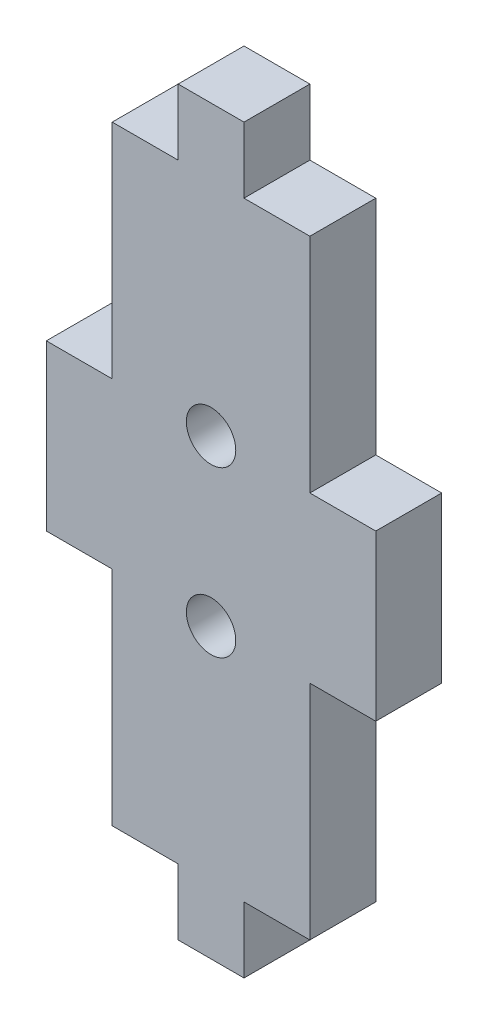
ISO-10303-21;
HEADER;
FILE_DESCRIPTION(('STEP AP214'),'2;1');
FILE_NAME('part.step','',(''),(''),'','','');
FILE_SCHEMA(('AUTOMOTIVE_DESIGN { 1 0 10303 214 1 1 1 1 }'));
ENDSEC;
DATA;
#1=APPLICATION_CONTEXT('core data for automotive mechanical design processes');
#2=APPLICATION_PROTOCOL_DEFINITION('international standard','automotive_design',2000,#1);
#3=PRODUCT_CONTEXT('',#1,'mechanical');
#4=PRODUCT('Part','Part','',(#3));
#5=PRODUCT_RELATED_PRODUCT_CATEGORY('part','',(#4));
#6=PRODUCT_DEFINITION_FORMATION('','',#4);
#7=PRODUCT_DEFINITION_CONTEXT('part definition',#1,'design');
#8=PRODUCT_DEFINITION('design','',#6,#7);
#9=PRODUCT_DEFINITION_SHAPE('','',#8);
#10=(LENGTH_UNIT() NAMED_UNIT(*) SI_UNIT(.MILLI.,.METRE.));
#11=(NAMED_UNIT(*) PLANE_ANGLE_UNIT() SI_UNIT($,.RADIAN.));
#12=(NAMED_UNIT(*) SI_UNIT($,.STERADIAN.) SOLID_ANGLE_UNIT());
#13=UNCERTAINTY_MEASURE_WITH_UNIT(LENGTH_MEASURE(1.E-05),#10,'distance_accuracy_value','');
#14=(GEOMETRIC_REPRESENTATION_CONTEXT(3) GLOBAL_UNCERTAINTY_ASSIGNED_CONTEXT((#13)) GLOBAL_UNIT_ASSIGNED_CONTEXT((#10,
#11,#12)) REPRESENTATION_CONTEXT('',''));
#15=CARTESIAN_POINT('',(0.,0.,0.));
#16=DIRECTION('',(0.,0.,1.));
#17=DIRECTION('',(1.,0.,0.));
#18=AXIS2_PLACEMENT_3D('',#15,#16,#17);
#19=CARTESIAN_POINT('',(0.,0.,4.));
#20=DIRECTION('',(0.,0.,1.));
#21=DIRECTION('',(1.,0.,0.));
#22=AXIS2_PLACEMENT_3D('',#19,#20,#21);
#23=PLANE('',#22);
#24=CARTESIAN_POINT('',(6.,23.5,4.));
#25=DIRECTION('',(0.,0.,1.));
#26=DIRECTION('',(1.,0.,0.));
#27=AXIS2_PLACEMENT_3D('',#24,#25,#26);
#28=CIRCLE('',#27,1.5);
#29=CARTESIAN_POINT('',(7.5,23.5,4.));
#30=VERTEX_POINT('',#29);
#31=EDGE_CURVE('E218',#30,#30,#28,.T.);
#32=ORIENTED_EDGE('',*,*,#31,.F.);
#33=EDGE_LOOP('',(#32));
#34=FACE_BOUND('',#33,.T.);
#35=DIRECTION('',(0.,-1.,0.));
#36=VECTOR('',#35,1.);
#37=CARTESIAN_POINT('',(0.,0.,4.));
#38=LINE('',#37,#36);
#39=CARTESIAN_POINT('',(0.,13.5,4.));
#40=VERTEX_POINT('',#39);
#41=CARTESIAN_POINT('',(0.,0.,4.));
#42=VERTEX_POINT('',#41);
#43=EDGE_CURVE('E272',#40,#42,#38,.T.);
#44=ORIENTED_EDGE('',*,*,#43,.T.);
#45=DIRECTION('',(1.,0.,0.));
#46=VECTOR('',#45,1.);
#47=CARTESIAN_POINT('',(0.,0.,4.));
#48=LINE('',#47,#46);
#49=CARTESIAN_POINT('',(4.00000000000001,0.,4.));
#50=VERTEX_POINT('',#49);
#51=EDGE_CURVE('E136',#42,#50,#48,.T.);
#52=ORIENTED_EDGE('',*,*,#51,.T.);
#53=DIRECTION('',(0.,-1.,0.));
#54=VECTOR('',#53,1.);
#55=CARTESIAN_POINT('',(4.00000000000001,0.,4.));
#56=LINE('',#55,#54);
#57=CARTESIAN_POINT('',(4.00000000000001,-4.,4.));
#58=VERTEX_POINT('',#57);
#59=EDGE_CURVE('E341',#50,#58,#56,.T.);
#60=ORIENTED_EDGE('',*,*,#59,.T.);
#61=DIRECTION('',(1.,0.,0.));
#62=VECTOR('',#61,1.);
#63=CARTESIAN_POINT('',(4.00000000000001,-4.,4.));
#64=LINE('',#63,#62);
#65=CARTESIAN_POINT('',(8.,-4.,4.));
#66=VERTEX_POINT('',#65);
#67=EDGE_CURVE('E361',#58,#66,#64,.T.);
#68=ORIENTED_EDGE('',*,*,#67,.T.);
#69=DIRECTION('',(0.,1.,0.));
#70=VECTOR('',#69,1.);
#71=CARTESIAN_POINT('',(8.,0.,4.));
#72=LINE('',#71,#70);
#73=CARTESIAN_POINT('',(8.,0.,4.));
#74=VERTEX_POINT('',#73);
#75=EDGE_CURVE('E357',#66,#74,#72,.T.);
#76=ORIENTED_EDGE('',*,*,#75,.T.);
#77=DIRECTION('',(1.,0.,0.));
#78=VECTOR('',#77,1.);
#79=CARTESIAN_POINT('',(8.,0.,4.));
#80=LINE('',#79,#78);
#81=CARTESIAN_POINT('',(12.,0.,4.));
#82=VERTEX_POINT('',#81);
#83=EDGE_CURVE('E360',#74,#82,#80,.T.);
#84=ORIENTED_EDGE('',*,*,#83,.T.);
#85=DIRECTION('',(0.,1.,0.));
#86=VECTOR('',#85,1.);
#87=CARTESIAN_POINT('',(12.,0.,4.));
#88=LINE('',#87,#86);
#89=CARTESIAN_POINT('',(12.,13.5,4.));
#90=VERTEX_POINT('',#89);
#91=EDGE_CURVE('E365',#82,#90,#88,.T.);
#92=ORIENTED_EDGE('',*,*,#91,.T.);
#93=DIRECTION('',(1.,0.,0.));
#94=VECTOR('',#93,1.);
#95=CARTESIAN_POINT('',(12.,13.5,4.));
#96=LINE('',#95,#94);
#97=CARTESIAN_POINT('',(16.,13.5,4.));
#98=VERTEX_POINT('',#97);
#99=EDGE_CURVE('E372',#90,#98,#96,.T.);
#100=ORIENTED_EDGE('',*,*,#99,.T.);
#101=DIRECTION('',(0.,1.,0.));
#102=VECTOR('',#101,1.);
#103=CARTESIAN_POINT('',(16.,23.5,4.));
#104=LINE('',#103,#102);
#105=CARTESIAN_POINT('',(16.,23.5,4.));
#106=VERTEX_POINT('',#105);
#107=EDGE_CURVE('E375',#98,#106,#104,.T.);
#108=ORIENTED_EDGE('',*,*,#107,.T.);
#109=DIRECTION('',(-1.,0.,0.));
#110=VECTOR('',#109,1.);
#111=CARTESIAN_POINT('',(12.,23.5,4.));
#112=LINE('',#111,#110);
#113=CARTESIAN_POINT('',(12.,23.5,4.));
#114=VERTEX_POINT('',#113);
#115=EDGE_CURVE('E378',#106,#114,#112,.T.);
#116=ORIENTED_EDGE('',*,*,#115,.T.);
#117=DIRECTION('',(0.,1.,0.));
#118=VECTOR('',#117,1.);
#119=CARTESIAN_POINT('',(12.,23.5,4.));
#120=LINE('',#119,#118);
#121=CARTESIAN_POINT('',(12.,37.,4.));
#122=VERTEX_POINT('',#121);
#123=EDGE_CURVE('E381',#114,#122,#120,.T.);
#124=ORIENTED_EDGE('',*,*,#123,.T.);
#125=DIRECTION('',(-1.,0.,0.));
#126=VECTOR('',#125,1.);
#127=CARTESIAN_POINT('',(8.,37.,4.));
#128=LINE('',#127,#126);
#129=CARTESIAN_POINT('',(8.,37.,4.));
#130=VERTEX_POINT('',#129);
#131=EDGE_CURVE('E384',#122,#130,#128,.T.);
#132=ORIENTED_EDGE('',*,*,#131,.T.);
#133=DIRECTION('',(0.,1.,0.));
#134=VECTOR('',#133,1.);
#135=CARTESIAN_POINT('',(8.,37.,4.));
#136=LINE('',#135,#134);
#137=CARTESIAN_POINT('',(8.,41.,4.));
#138=VERTEX_POINT('',#137);
#139=EDGE_CURVE('E387',#130,#138,#136,.T.);
#140=ORIENTED_EDGE('',*,*,#139,.T.);
#141=DIRECTION('',(-1.,0.,0.));
#142=VECTOR('',#141,1.);
#143=CARTESIAN_POINT('',(4.,41.,4.));
#144=LINE('',#143,#142);
#145=CARTESIAN_POINT('',(4.,41.,4.));
#146=VERTEX_POINT('',#145);
#147=EDGE_CURVE('E390',#138,#146,#144,.T.);
#148=ORIENTED_EDGE('',*,*,#147,.T.);
#149=DIRECTION('',(0.,-1.,0.));
#150=VECTOR('',#149,1.);
#151=CARTESIAN_POINT('',(4.,37.,4.));
#152=LINE('',#151,#150);
#153=CARTESIAN_POINT('',(4.,37.,4.));
#154=VERTEX_POINT('',#153);
#155=EDGE_CURVE('E393',#146,#154,#152,.T.);
#156=ORIENTED_EDGE('',*,*,#155,.T.);
#157=DIRECTION('',(-1.,0.,0.));
#158=VECTOR('',#157,1.);
#159=CARTESIAN_POINT('',(0.,37.,4.));
#160=LINE('',#159,#158);
#161=CARTESIAN_POINT('',(0.,37.,4.));
#162=VERTEX_POINT('',#161);
#163=EDGE_CURVE('E396',#154,#162,#160,.T.);
#164=ORIENTED_EDGE('',*,*,#163,.T.);
#165=DIRECTION('',(0.,-1.,0.));
#166=VECTOR('',#165,1.);
#167=CARTESIAN_POINT('',(0.,23.5,4.));
#168=LINE('',#167,#166);
#169=CARTESIAN_POINT('',(0.,23.5,4.));
#170=VERTEX_POINT('',#169);
#171=EDGE_CURVE('E191',#162,#170,#168,.T.);
#172=ORIENTED_EDGE('',*,*,#171,.T.);
#173=DIRECTION('',(-1.,0.,0.));
#174=VECTOR('',#173,1.);
#175=CARTESIAN_POINT('',(0.,23.5,4.));
#176=LINE('',#175,#174);
#177=CARTESIAN_POINT('',(-4.,23.5,4.));
#178=VERTEX_POINT('',#177);
#179=EDGE_CURVE('E185',#170,#178,#176,.T.);
#180=ORIENTED_EDGE('',*,*,#179,.T.);
#181=DIRECTION('',(0.,-1.,0.));
#182=VECTOR('',#181,1.);
#183=CARTESIAN_POINT('',(-4.,23.5,4.));
#184=LINE('',#183,#182);
#185=CARTESIAN_POINT('',(-4.,13.5,4.));
#186=VERTEX_POINT('',#185);
#187=EDGE_CURVE('E189',#178,#186,#184,.T.);
#188=ORIENTED_EDGE('',*,*,#187,.T.);
#189=DIRECTION('',(1.,0.,0.));
#190=VECTOR('',#189,1.);
#191=CARTESIAN_POINT('',(0.,13.5,4.));
#192=LINE('',#191,#190);
#193=EDGE_CURVE('E57',#186,#40,#192,.T.);
#194=ORIENTED_EDGE('',*,*,#193,.T.);
#195=EDGE_LOOP('',(#44,#52,#60,#68,#76,#84,#92,#100,#108,#116,#124,#132,#140,#148,#156,#164,
#172,#180,#188,#194));
#196=FACE_BOUND('',#195,.T.);
#197=CARTESIAN_POINT('',(6.,13.5,4.));
#198=DIRECTION('',(0.,0.,1.));
#199=DIRECTION('',(-1.,0.,0.));
#200=AXIS2_PLACEMENT_3D('',#197,#198,#199);
#201=CIRCLE('',#200,1.5);
#202=CARTESIAN_POINT('',(4.5,13.5,4.));
#203=VERTEX_POINT('',#202);
#204=EDGE_CURVE('E440',#203,#203,#201,.T.);
#205=ORIENTED_EDGE('',*,*,#204,.F.);
#206=EDGE_LOOP('',(#205));
#207=FACE_BOUND('',#206,.T.);
#208=ADVANCED_FACE('F39',(#34,#196,#207),#23,.T.);
#209=CARTESIAN_POINT('',(0.,0.,0.));
#210=DIRECTION('',(0.,0.,1.));
#211=DIRECTION('',(1.,0.,0.));
#212=AXIS2_PLACEMENT_3D('',#209,#210,#211);
#213=PLANE('',#212);
#214=DIRECTION('',(0.,-1.,0.));
#215=VECTOR('',#214,1.);
#216=CARTESIAN_POINT('',(0.,0.,0.));
#217=LINE('',#216,#215);
#218=CARTESIAN_POINT('',(0.,13.5,0.));
#219=VERTEX_POINT('',#218);
#220=CARTESIAN_POINT('',(0.,0.,0.));
#221=VERTEX_POINT('',#220);
#222=EDGE_CURVE('E213',#219,#221,#217,.T.);
#223=ORIENTED_EDGE('',*,*,#222,.F.);
#224=DIRECTION('',(1.,0.,0.));
#225=VECTOR('',#224,1.);
#226=CARTESIAN_POINT('',(0.,13.5,0.));
#227=LINE('',#226,#225);
#228=CARTESIAN_POINT('',(-4.,13.5,0.));
#229=VERTEX_POINT('',#228);
#230=EDGE_CURVE('E128',#229,#219,#227,.T.);
#231=ORIENTED_EDGE('',*,*,#230,.F.);
#232=DIRECTION('',(0.,-1.,0.));
#233=VECTOR('',#232,1.);
#234=CARTESIAN_POINT('',(-4.,23.5,0.));
#235=LINE('',#234,#233);
#236=CARTESIAN_POINT('',(-4.,23.5,0.));
#237=VERTEX_POINT('',#236);
#238=EDGE_CURVE('E122',#237,#229,#235,.T.);
#239=ORIENTED_EDGE('',*,*,#238,.F.);
#240=DIRECTION('',(-1.,0.,0.));
#241=VECTOR('',#240,1.);
#242=CARTESIAN_POINT('',(0.,23.5,0.));
#243=LINE('',#242,#241);
#244=CARTESIAN_POINT('',(0.,23.5,0.));
#245=VERTEX_POINT('',#244);
#246=EDGE_CURVE('E200',#245,#237,#243,.T.);
#247=ORIENTED_EDGE('',*,*,#246,.F.);
#248=DIRECTION('',(0.,-1.,0.));
#249=VECTOR('',#248,1.);
#250=CARTESIAN_POINT('',(0.,23.5,0.));
#251=LINE('',#250,#249);
#252=CARTESIAN_POINT('',(0.,37.,0.));
#253=VERTEX_POINT('',#252);
#254=EDGE_CURVE('E263',#253,#245,#251,.T.);
#255=ORIENTED_EDGE('',*,*,#254,.F.);
#256=DIRECTION('',(-1.,0.,0.));
#257=VECTOR('',#256,1.);
#258=CARTESIAN_POINT('',(0.,37.,0.));
#259=LINE('',#258,#257);
#260=CARTESIAN_POINT('',(4.,37.,0.));
#261=VERTEX_POINT('',#260);
#262=EDGE_CURVE('E260',#261,#253,#259,.T.);
#263=ORIENTED_EDGE('',*,*,#262,.F.);
#264=DIRECTION('',(0.,-1.,0.));
#265=VECTOR('',#264,1.);
#266=CARTESIAN_POINT('',(4.,37.,0.));
#267=LINE('',#266,#265);
#268=CARTESIAN_POINT('',(4.,41.,0.));
#269=VERTEX_POINT('',#268);
#270=EDGE_CURVE('E257',#269,#261,#267,.T.);
#271=ORIENTED_EDGE('',*,*,#270,.F.);
#272=DIRECTION('',(-1.,0.,0.));
#273=VECTOR('',#272,1.);
#274=CARTESIAN_POINT('',(4.,41.,0.));
#275=LINE('',#274,#273);
#276=CARTESIAN_POINT('',(8.,41.,0.));
#277=VERTEX_POINT('',#276);
#278=EDGE_CURVE('E254',#277,#269,#275,.T.);
#279=ORIENTED_EDGE('',*,*,#278,.F.);
#280=DIRECTION('',(0.,1.,0.));
#281=VECTOR('',#280,1.);
#282=CARTESIAN_POINT('',(8.,37.,0.));
#283=LINE('',#282,#281);
#284=CARTESIAN_POINT('',(8.,37.,0.));
#285=VERTEX_POINT('',#284);
#286=EDGE_CURVE('E251',#285,#277,#283,.T.);
#287=ORIENTED_EDGE('',*,*,#286,.F.);
#288=DIRECTION('',(-1.,0.,0.));
#289=VECTOR('',#288,1.);
#290=CARTESIAN_POINT('',(8.,37.,0.));
#291=LINE('',#290,#289);
#292=CARTESIAN_POINT('',(12.,37.,0.));
#293=VERTEX_POINT('',#292);
#294=EDGE_CURVE('E248',#293,#285,#291,.T.);
#295=ORIENTED_EDGE('',*,*,#294,.F.);
#296=DIRECTION('',(0.,1.,0.));
#297=VECTOR('',#296,1.);
#298=CARTESIAN_POINT('',(12.,23.5,0.));
#299=LINE('',#298,#297);
#300=CARTESIAN_POINT('',(12.,23.5,0.));
#301=VERTEX_POINT('',#300);
#302=EDGE_CURVE('E245',#301,#293,#299,.T.);
#303=ORIENTED_EDGE('',*,*,#302,.F.);
#304=DIRECTION('',(-1.,0.,0.));
#305=VECTOR('',#304,1.);
#306=CARTESIAN_POINT('',(12.,23.5,0.));
#307=LINE('',#306,#305);
#308=CARTESIAN_POINT('',(16.,23.5,0.));
#309=VERTEX_POINT('',#308);
#310=EDGE_CURVE('E242',#309,#301,#307,.T.);
#311=ORIENTED_EDGE('',*,*,#310,.F.);
#312=DIRECTION('',(0.,1.,0.));
#313=VECTOR('',#312,1.);
#314=CARTESIAN_POINT('',(16.,23.5,0.));
#315=LINE('',#314,#313);
#316=CARTESIAN_POINT('',(16.,13.5,0.));
#317=VERTEX_POINT('',#316);
#318=EDGE_CURVE('E239',#317,#309,#315,.T.);
#319=ORIENTED_EDGE('',*,*,#318,.F.);
#320=DIRECTION('',(1.,0.,0.));
#321=VECTOR('',#320,1.);
#322=CARTESIAN_POINT('',(12.,13.5,0.));
#323=LINE('',#322,#321);
#324=CARTESIAN_POINT('',(12.,13.5,0.));
#325=VERTEX_POINT('',#324);
#326=EDGE_CURVE('E236',#325,#317,#323,.T.);
#327=ORIENTED_EDGE('',*,*,#326,.F.);
#328=DIRECTION('',(0.,1.,0.));
#329=VECTOR('',#328,1.);
#330=CARTESIAN_POINT('',(12.,0.,0.));
#331=LINE('',#330,#329);
#332=CARTESIAN_POINT('',(12.,0.,0.));
#333=VERTEX_POINT('',#332);
#334=EDGE_CURVE('E233',#333,#325,#331,.T.);
#335=ORIENTED_EDGE('',*,*,#334,.F.);
#336=DIRECTION('',(1.,0.,0.));
#337=VECTOR('',#336,1.);
#338=CARTESIAN_POINT('',(8.,0.,0.));
#339=LINE('',#338,#337);
#340=CARTESIAN_POINT('',(8.,0.,0.));
#341=VERTEX_POINT('',#340);
#342=EDGE_CURVE('E230',#341,#333,#339,.T.);
#343=ORIENTED_EDGE('',*,*,#342,.F.);
#344=DIRECTION('',(0.,1.,0.));
#345=VECTOR('',#344,1.);
#346=CARTESIAN_POINT('',(8.,0.,0.));
#347=LINE('',#346,#345);
#348=CARTESIAN_POINT('',(8.,-4.,0.));
#349=VERTEX_POINT('',#348);
#350=EDGE_CURVE('E227',#349,#341,#347,.T.);
#351=ORIENTED_EDGE('',*,*,#350,.F.);
#352=DIRECTION('',(1.,0.,0.));
#353=VECTOR('',#352,1.);
#354=CARTESIAN_POINT('',(4.00000000000001,-4.,0.));
#355=LINE('',#354,#353);
#356=CARTESIAN_POINT('',(4.00000000000001,-4.,0.));
#357=VERTEX_POINT('',#356);
#358=EDGE_CURVE('E224',#357,#349,#355,.T.);
#359=ORIENTED_EDGE('',*,*,#358,.F.);
#360=DIRECTION('',(0.,-1.,0.));
#361=VECTOR('',#360,1.);
#362=CARTESIAN_POINT('',(4.00000000000001,0.,0.));
#363=LINE('',#362,#361);
#364=CARTESIAN_POINT('',(4.00000000000001,0.,0.));
#365=VERTEX_POINT('',#364);
#366=EDGE_CURVE('E221',#365,#357,#363,.T.);
#367=ORIENTED_EDGE('',*,*,#366,.F.);
#368=DIRECTION('',(1.,0.,0.));
#369=VECTOR('',#368,1.);
#370=CARTESIAN_POINT('',(0.,0.,0.));
#371=LINE('',#370,#369);
#372=EDGE_CURVE('E217',#221,#365,#371,.T.);
#373=ORIENTED_EDGE('',*,*,#372,.F.);
#374=EDGE_LOOP('',(#223,#231,#239,#247,#255,#263,#271,#279,#287,#295,#303,#311,#319,#327,#335,
#343,#351,#359,#367,#373));
#375=FACE_BOUND('',#374,.T.);
#376=CARTESIAN_POINT('',(6.,23.5,0.));
#377=DIRECTION('',(0.,0.,1.));
#378=DIRECTION('',(1.,0.,0.));
#379=AXIS2_PLACEMENT_3D('',#376,#377,#378);
#380=CIRCLE('',#379,1.5);
#381=CARTESIAN_POINT('',(7.5,23.5,0.));
#382=VERTEX_POINT('',#381);
#383=EDGE_CURVE('E448',#382,#382,#380,.T.);
#384=ORIENTED_EDGE('',*,*,#383,.T.);
#385=EDGE_LOOP('',(#384));
#386=FACE_BOUND('',#385,.T.);
#387=CARTESIAN_POINT('',(6.,13.5,0.));
#388=DIRECTION('',(0.,0.,1.));
#389=DIRECTION('',(-1.,0.,0.));
#390=AXIS2_PLACEMENT_3D('',#387,#388,#389);
#391=CIRCLE('',#390,1.5);
#392=CARTESIAN_POINT('',(4.5,13.5,0.));
#393=VERTEX_POINT('',#392);
#394=EDGE_CURVE('E443',#393,#393,#391,.T.);
#395=ORIENTED_EDGE('',*,*,#394,.T.);
#396=EDGE_LOOP('',(#395));
#397=FACE_BOUND('',#396,.T.);
#398=ADVANCED_FACE('F345',(#375,#386,#397),#213,.F.);
#399=CARTESIAN_POINT('',(0.,0.,4.));
#400=DIRECTION('',(1.,0.,0.));
#401=DIRECTION('',(0.,0.,-1.));
#402=AXIS2_PLACEMENT_3D('',#399,#400,#401);
#403=PLANE('',#402);
#404=ORIENTED_EDGE('',*,*,#222,.T.);
#405=DIRECTION('',(0.,0.,-1.));
#406=VECTOR('',#405,1.);
#407=CARTESIAN_POINT('',(0.,0.,4.));
#408=LINE('',#407,#406);
#409=EDGE_CURVE('E11',#42,#221,#408,.T.);
#410=ORIENTED_EDGE('',*,*,#409,.F.);
#411=ORIENTED_EDGE('',*,*,#43,.F.);
#412=DIRECTION('',(0.,0.,-1.));
#413=VECTOR('',#412,1.);
#414=CARTESIAN_POINT('',(0.,13.5,4.));
#415=LINE('',#414,#413);
#416=EDGE_CURVE('E209',#40,#219,#415,.T.);
#417=ORIENTED_EDGE('',*,*,#416,.T.);
#418=EDGE_LOOP('',(#404,#410,#411,#417));
#419=FACE_BOUND('',#418,.T.);
#420=ADVANCED_FACE('F41',(#419),#403,.F.);
#421=CARTESIAN_POINT('',(0.,0.,4.));
#422=DIRECTION('',(0.,1.,0.));
#423=DIRECTION('',(0.,0.,1.));
#424=AXIS2_PLACEMENT_3D('',#421,#422,#423);
#425=PLANE('',#424);
#426=ORIENTED_EDGE('',*,*,#372,.T.);
#427=DIRECTION('',(0.,0.,-1.));
#428=VECTOR('',#427,1.);
#429=CARTESIAN_POINT('',(4.00000000000001,0.,4.));
#430=LINE('',#429,#428);
#431=EDGE_CURVE('E49',#50,#365,#430,.T.);
#432=ORIENTED_EDGE('',*,*,#431,.F.);
#433=ORIENTED_EDGE('',*,*,#51,.F.);
#434=ORIENTED_EDGE('',*,*,#409,.T.);
#435=EDGE_LOOP('',(#426,#432,#433,#434));
#436=FACE_BOUND('',#435,.T.);
#437=ADVANCED_FACE('F626',(#436),#425,.F.);
#438=CARTESIAN_POINT('',(4.00000000000001,0.,4.));
#439=DIRECTION('',(1.,0.,0.));
#440=DIRECTION('',(0.,0.,-1.));
#441=AXIS2_PLACEMENT_3D('',#438,#439,#440);
#442=PLANE('',#441);
#443=ORIENTED_EDGE('',*,*,#366,.T.);
#444=DIRECTION('',(0.,0.,-1.));
#445=VECTOR('',#444,1.);
#446=CARTESIAN_POINT('',(4.00000000000001,-4.,4.));
#447=LINE('',#446,#445);
#448=EDGE_CURVE('E331',#58,#357,#447,.T.);
#449=ORIENTED_EDGE('',*,*,#448,.F.);
#450=ORIENTED_EDGE('',*,*,#59,.F.);
#451=ORIENTED_EDGE('',*,*,#431,.T.);
#452=EDGE_LOOP('',(#443,#449,#450,#451));
#453=FACE_BOUND('',#452,.T.);
#454=ADVANCED_FACE('F339',(#453),#442,.F.);
#455=CARTESIAN_POINT('',(4.00000000000001,-4.,4.));
#456=DIRECTION('',(0.,1.,0.));
#457=DIRECTION('',(-1.,0.,0.));
#458=AXIS2_PLACEMENT_3D('',#455,#456,#457);
#459=PLANE('',#458);
#460=ORIENTED_EDGE('',*,*,#358,.T.);
#461=DIRECTION('',(0.,0.,-1.));
#462=VECTOR('',#461,1.);
#463=CARTESIAN_POINT('',(8.,-4.,4.));
#464=LINE('',#463,#462);
#465=EDGE_CURVE('E327',#66,#349,#464,.T.);
#466=ORIENTED_EDGE('',*,*,#465,.F.);
#467=ORIENTED_EDGE('',*,*,#67,.F.);
#468=ORIENTED_EDGE('',*,*,#448,.T.);
#469=EDGE_LOOP('',(#460,#466,#467,#468));
#470=FACE_BOUND('',#469,.T.);
#471=ADVANCED_FACE('F351',(#470),#459,.F.);
#472=CARTESIAN_POINT('',(8.,0.,4.));
#473=DIRECTION('',(-1.,0.,0.));
#474=DIRECTION('',(0.,-1.,0.));
#475=AXIS2_PLACEMENT_3D('',#472,#473,#474);
#476=PLANE('',#475);
#477=ORIENTED_EDGE('',*,*,#350,.T.);
#478=DIRECTION('',(0.,0.,-1.));
#479=VECTOR('',#478,1.);
#480=CARTESIAN_POINT('',(8.,0.,4.));
#481=LINE('',#480,#479);
#482=EDGE_CURVE('E323',#74,#341,#481,.T.);
#483=ORIENTED_EDGE('',*,*,#482,.F.);
#484=ORIENTED_EDGE('',*,*,#75,.F.);
#485=ORIENTED_EDGE('',*,*,#465,.T.);
#486=EDGE_LOOP('',(#477,#483,#484,#485));
#487=FACE_BOUND('',#486,.T.);
#488=ADVANCED_FACE('F355',(#487),#476,.F.);
#489=CARTESIAN_POINT('',(8.,0.,4.));
#490=DIRECTION('',(0.,1.,0.));
#491=DIRECTION('',(-1.,0.,0.));
#492=AXIS2_PLACEMENT_3D('',#489,#490,#491);
#493=PLANE('',#492);
#494=ORIENTED_EDGE('',*,*,#342,.T.);
#495=DIRECTION('',(0.,0.,-1.));
#496=VECTOR('',#495,1.);
#497=CARTESIAN_POINT('',(12.,0.,4.));
#498=LINE('',#497,#496);
#499=EDGE_CURVE('E319',#82,#333,#498,.T.);
#500=ORIENTED_EDGE('',*,*,#499,.F.);
#501=ORIENTED_EDGE('',*,*,#83,.F.);
#502=ORIENTED_EDGE('',*,*,#482,.T.);
#503=EDGE_LOOP('',(#494,#500,#501,#502));
#504=FACE_BOUND('',#503,.T.);
#505=ADVANCED_FACE('F591',(#504),#493,.F.);
#506=CARTESIAN_POINT('',(12.,0.,4.));
#507=DIRECTION('',(-1.,0.,0.));
#508=DIRECTION('',(0.,-1.,0.));
#509=AXIS2_PLACEMENT_3D('',#506,#507,#508);
#510=PLANE('',#509);
#511=ORIENTED_EDGE('',*,*,#334,.T.);
#512=DIRECTION('',(0.,0.,-1.));
#513=VECTOR('',#512,1.);
#514=CARTESIAN_POINT('',(12.,13.5,4.));
#515=LINE('',#514,#513);
#516=EDGE_CURVE('E315',#90,#325,#515,.T.);
#517=ORIENTED_EDGE('',*,*,#516,.F.);
#518=ORIENTED_EDGE('',*,*,#91,.F.);
#519=ORIENTED_EDGE('',*,*,#499,.T.);
#520=EDGE_LOOP('',(#511,#517,#518,#519));
#521=FACE_BOUND('',#520,.T.);
#522=ADVANCED_FACE('F581',(#521),#510,.F.);
#523=CARTESIAN_POINT('',(12.,13.5,4.));
#524=DIRECTION('',(0.,1.,0.));
#525=DIRECTION('',(0.,0.,1.));
#526=AXIS2_PLACEMENT_3D('',#523,#524,#525);
#527=PLANE('',#526);
#528=ORIENTED_EDGE('',*,*,#326,.T.);
#529=DIRECTION('',(0.,0.,-1.));
#530=VECTOR('',#529,1.);
#531=CARTESIAN_POINT('',(16.,13.5,4.));
#532=LINE('',#531,#530);
#533=EDGE_CURVE('E311',#98,#317,#532,.T.);
#534=ORIENTED_EDGE('',*,*,#533,.F.);
#535=ORIENTED_EDGE('',*,*,#99,.F.);
#536=ORIENTED_EDGE('',*,*,#516,.T.);
#537=EDGE_LOOP('',(#528,#534,#535,#536));
#538=FACE_BOUND('',#537,.T.);
#539=ADVANCED_FACE('F571',(#538),#527,.F.);
#540=CARTESIAN_POINT('',(16.,23.5,4.));
#541=DIRECTION('',(-1.,0.,0.));
#542=DIRECTION('',(0.,0.,1.));
#543=AXIS2_PLACEMENT_3D('',#540,#541,#542);
#544=PLANE('',#543);
#545=ORIENTED_EDGE('',*,*,#318,.T.);
#546=DIRECTION('',(0.,0.,-1.));
#547=VECTOR('',#546,1.);
#548=CARTESIAN_POINT('',(16.,23.5,4.));
#549=LINE('',#548,#547);
#550=EDGE_CURVE('E307',#106,#309,#549,.T.);
#551=ORIENTED_EDGE('',*,*,#550,.F.);
#552=ORIENTED_EDGE('',*,*,#107,.F.);
#553=ORIENTED_EDGE('',*,*,#533,.T.);
#554=EDGE_LOOP('',(#545,#551,#552,#553));
#555=FACE_BOUND('',#554,.T.);
#556=ADVANCED_FACE('F561',(#555),#544,.F.);
#557=CARTESIAN_POINT('',(12.,23.5,4.));
#558=DIRECTION('',(0.,-1.,0.));
#559=DIRECTION('',(0.,0.,-1.));
#560=AXIS2_PLACEMENT_3D('',#557,#558,#559);
#561=PLANE('',#560);
#562=ORIENTED_EDGE('',*,*,#310,.T.);
#563=DIRECTION('',(0.,0.,-1.));
#564=VECTOR('',#563,1.);
#565=CARTESIAN_POINT('',(12.,23.5,4.));
#566=LINE('',#565,#564);
#567=EDGE_CURVE('E303',#114,#301,#566,.T.);
#568=ORIENTED_EDGE('',*,*,#567,.F.);
#569=ORIENTED_EDGE('',*,*,#115,.F.);
#570=ORIENTED_EDGE('',*,*,#550,.T.);
#571=EDGE_LOOP('',(#562,#568,#569,#570));
#572=FACE_BOUND('',#571,.T.);
#573=ADVANCED_FACE('F551',(#572),#561,.F.);
#574=CARTESIAN_POINT('',(12.,23.5,4.));
#575=DIRECTION('',(-1.,0.,0.));
#576=DIRECTION('',(0.,-1.,0.));
#577=AXIS2_PLACEMENT_3D('',#574,#575,#576);
#578=PLANE('',#577);
#579=ORIENTED_EDGE('',*,*,#302,.T.);
#580=DIRECTION('',(0.,0.,-1.));
#581=VECTOR('',#580,1.);
#582=CARTESIAN_POINT('',(12.,37.,4.));
#583=LINE('',#582,#581);
#584=EDGE_CURVE('E299',#122,#293,#583,.T.);
#585=ORIENTED_EDGE('',*,*,#584,.F.);
#586=ORIENTED_EDGE('',*,*,#123,.F.);
#587=ORIENTED_EDGE('',*,*,#567,.T.);
#588=EDGE_LOOP('',(#579,#585,#586,#587));
#589=FACE_BOUND('',#588,.T.);
#590=ADVANCED_FACE('F541',(#589),#578,.F.);
#591=CARTESIAN_POINT('',(8.,37.,4.));
#592=DIRECTION('',(0.,-1.,0.));
#593=DIRECTION('',(0.,0.,-1.));
#594=AXIS2_PLACEMENT_3D('',#591,#592,#593);
#595=PLANE('',#594);
#596=ORIENTED_EDGE('',*,*,#294,.T.);
#597=DIRECTION('',(0.,0.,-1.));
#598=VECTOR('',#597,1.);
#599=CARTESIAN_POINT('',(8.,37.,4.));
#600=LINE('',#599,#598);
#601=EDGE_CURVE('E295',#130,#285,#600,.T.);
#602=ORIENTED_EDGE('',*,*,#601,.F.);
#603=ORIENTED_EDGE('',*,*,#131,.F.);
#604=ORIENTED_EDGE('',*,*,#584,.T.);
#605=EDGE_LOOP('',(#596,#602,#603,#604));
#606=FACE_BOUND('',#605,.T.);
#607=ADVANCED_FACE('F531',(#606),#595,.F.);
#608=CARTESIAN_POINT('',(8.,37.,4.));
#609=DIRECTION('',(-1.,0.,0.));
#610=DIRECTION('',(0.,-1.,0.));
#611=AXIS2_PLACEMENT_3D('',#608,#609,#610);
#612=PLANE('',#611);
#613=ORIENTED_EDGE('',*,*,#286,.T.);
#614=DIRECTION('',(0.,0.,-1.));
#615=VECTOR('',#614,1.);
#616=CARTESIAN_POINT('',(8.,41.,4.));
#617=LINE('',#616,#615);
#618=EDGE_CURVE('E291',#138,#277,#617,.T.);
#619=ORIENTED_EDGE('',*,*,#618,.F.);
#620=ORIENTED_EDGE('',*,*,#139,.F.);
#621=ORIENTED_EDGE('',*,*,#601,.T.);
#622=EDGE_LOOP('',(#613,#619,#620,#621));
#623=FACE_BOUND('',#622,.T.);
#624=ADVANCED_FACE('F521',(#623),#612,.F.);
#625=CARTESIAN_POINT('',(4.,41.,4.));
#626=DIRECTION('',(0.,-1.,0.));
#627=DIRECTION('',(0.,0.,-1.));
#628=AXIS2_PLACEMENT_3D('',#625,#626,#627);
#629=PLANE('',#628);
#630=ORIENTED_EDGE('',*,*,#278,.T.);
#631=DIRECTION('',(0.,0.,-1.));
#632=VECTOR('',#631,1.);
#633=CARTESIAN_POINT('',(4.,41.,4.));
#634=LINE('',#633,#632);
#635=EDGE_CURVE('E287',#146,#269,#634,.T.);
#636=ORIENTED_EDGE('',*,*,#635,.F.);
#637=ORIENTED_EDGE('',*,*,#147,.F.);
#638=ORIENTED_EDGE('',*,*,#618,.T.);
#639=EDGE_LOOP('',(#630,#636,#637,#638));
#640=FACE_BOUND('',#639,.T.);
#641=ADVANCED_FACE('F511',(#640),#629,.F.);
#642=CARTESIAN_POINT('',(4.,37.,4.));
#643=DIRECTION('',(1.,0.,0.));
#644=DIRECTION('',(0.,1.,0.));
#645=AXIS2_PLACEMENT_3D('',#642,#643,#644);
#646=PLANE('',#645);
#647=ORIENTED_EDGE('',*,*,#270,.T.);
#648=DIRECTION('',(0.,0.,-1.));
#649=VECTOR('',#648,1.);
#650=CARTESIAN_POINT('',(4.,37.,4.));
#651=LINE('',#650,#649);
#652=EDGE_CURVE('E283',#154,#261,#651,.T.);
#653=ORIENTED_EDGE('',*,*,#652,.F.);
#654=ORIENTED_EDGE('',*,*,#155,.F.);
#655=ORIENTED_EDGE('',*,*,#635,.T.);
#656=EDGE_LOOP('',(#647,#653,#654,#655));
#657=FACE_BOUND('',#656,.T.);
#658=ADVANCED_FACE('F502',(#657),#646,.F.);
#659=CARTESIAN_POINT('',(0.,37.,4.));
#660=DIRECTION('',(0.,-1.,0.));
#661=DIRECTION('',(0.,0.,-1.));
#662=AXIS2_PLACEMENT_3D('',#659,#660,#661);
#663=PLANE('',#662);
#664=ORIENTED_EDGE('',*,*,#262,.T.);
#665=DIRECTION('',(0.,0.,-1.));
#666=VECTOR('',#665,1.);
#667=CARTESIAN_POINT('',(0.,37.,4.));
#668=LINE('',#667,#666);
#669=EDGE_CURVE('E279',#162,#253,#668,.T.);
#670=ORIENTED_EDGE('',*,*,#669,.F.);
#671=ORIENTED_EDGE('',*,*,#163,.F.);
#672=ORIENTED_EDGE('',*,*,#652,.T.);
#673=EDGE_LOOP('',(#664,#670,#671,#672));
#674=FACE_BOUND('',#673,.T.);
#675=ADVANCED_FACE('F404',(#674),#663,.F.);
#676=CARTESIAN_POINT('',(0.,23.5,4.));
#677=DIRECTION('',(1.,0.,0.));
#678=DIRECTION('',(0.,0.,-1.));
#679=AXIS2_PLACEMENT_3D('',#676,#677,#678);
#680=PLANE('',#679);
#681=ORIENTED_EDGE('',*,*,#254,.T.);
#682=DIRECTION('',(0.,0.,-1.));
#683=VECTOR('',#682,1.);
#684=CARTESIAN_POINT('',(0.,23.5,4.));
#685=LINE('',#684,#683);
#686=EDGE_CURVE('E202',#170,#245,#685,.T.);
#687=ORIENTED_EDGE('',*,*,#686,.F.);
#688=ORIENTED_EDGE('',*,*,#171,.F.);
#689=ORIENTED_EDGE('',*,*,#669,.T.);
#690=EDGE_LOOP('',(#681,#687,#688,#689));
#691=FACE_BOUND('',#690,.T.);
#692=ADVANCED_FACE('F408',(#691),#680,.F.);
#693=CARTESIAN_POINT('',(0.,23.5,4.));
#694=DIRECTION('',(0.,-1.,0.));
#695=DIRECTION('',(0.,0.,-1.));
#696=AXIS2_PLACEMENT_3D('',#693,#694,#695);
#697=PLANE('',#696);
#698=ORIENTED_EDGE('',*,*,#246,.T.);
#699=DIRECTION('',(0.,0.,-1.));
#700=VECTOR('',#699,1.);
#701=CARTESIAN_POINT('',(-4.,23.5,4.));
#702=LINE('',#701,#700);
#703=EDGE_CURVE('E197',#178,#237,#702,.T.);
#704=ORIENTED_EDGE('',*,*,#703,.F.);
#705=ORIENTED_EDGE('',*,*,#179,.F.);
#706=ORIENTED_EDGE('',*,*,#686,.T.);
#707=EDGE_LOOP('',(#698,#704,#705,#706));
#708=FACE_BOUND('',#707,.T.);
#709=ADVANCED_FACE('F198',(#708),#697,.F.);
#710=CARTESIAN_POINT('',(-4.,23.5,4.));
#711=DIRECTION('',(1.,0.,0.));
#712=DIRECTION('',(0.,1.,0.));
#713=AXIS2_PLACEMENT_3D('',#710,#711,#712);
#714=PLANE('',#713);
#715=ORIENTED_EDGE('',*,*,#238,.T.);
#716=DIRECTION('',(0.,0.,-1.));
#717=VECTOR('',#716,1.);
#718=CARTESIAN_POINT('',(-4.,13.5,4.));
#719=LINE('',#718,#717);
#720=EDGE_CURVE('E203',#186,#229,#719,.T.);
#721=ORIENTED_EDGE('',*,*,#720,.F.);
#722=ORIENTED_EDGE('',*,*,#187,.F.);
#723=ORIENTED_EDGE('',*,*,#703,.T.);
#724=EDGE_LOOP('',(#715,#721,#722,#723));
#725=FACE_BOUND('',#724,.T.);
#726=ADVANCED_FACE('F205',(#725),#714,.F.);
#727=CARTESIAN_POINT('',(0.,13.5,4.));
#728=DIRECTION('',(0.,1.,0.));
#729=DIRECTION('',(0.,0.,1.));
#730=AXIS2_PLACEMENT_3D('',#727,#728,#729);
#731=PLANE('',#730);
#732=ORIENTED_EDGE('',*,*,#230,.T.);
#733=ORIENTED_EDGE('',*,*,#416,.F.);
#734=ORIENTED_EDGE('',*,*,#193,.F.);
#735=ORIENTED_EDGE('',*,*,#720,.T.);
#736=EDGE_LOOP('',(#732,#733,#734,#735));
#737=FACE_BOUND('',#736,.T.);
#738=ADVANCED_FACE('F412',(#737),#731,.F.);
#739=CARTESIAN_POINT('',(6.,23.5,4.));
#740=DIRECTION('',(0.,0.,-1.));
#741=DIRECTION('',(-1.,0.,0.));
#742=AXIS2_PLACEMENT_3D('',#739,#740,#741);
#743=CYLINDRICAL_SURFACE('',#742,1.5);
#744=ORIENTED_EDGE('',*,*,#31,.T.);
#745=EDGE_LOOP('',(#744));
#746=FACE_BOUND('',#745,.T.);
#747=ORIENTED_EDGE('',*,*,#383,.F.);
#748=EDGE_LOOP('',(#747));
#749=FACE_BOUND('',#748,.T.);
#750=ADVANCED_FACE('F414',(#746,#749),#743,.F.);
#751=CARTESIAN_POINT('',(6.,13.5,4.));
#752=DIRECTION('',(0.,0.,-1.));
#753=DIRECTION('',(-1.,0.,0.));
#754=AXIS2_PLACEMENT_3D('',#751,#752,#753);
#755=CYLINDRICAL_SURFACE('',#754,1.5);
#756=ORIENTED_EDGE('',*,*,#204,.T.);
#757=EDGE_LOOP('',(#756));
#758=FACE_BOUND('',#757,.T.);
#759=ORIENTED_EDGE('',*,*,#394,.F.);
#760=EDGE_LOOP('',(#759));
#761=FACE_BOUND('',#760,.T.);
#762=ADVANCED_FACE('F420',(#758,#761),#755,.F.);
#763=CLOSED_SHELL('',(#208,#398,#420,#437,#454,#471,#488,#505,#522,#539,#556,#573,#590,#607,
#624,#641,#658,#675,#692,#709,#726,#738,#750,#762));
#764=MANIFOLD_SOLID_BREP('B2',#763);
#765=ADVANCED_BREP_SHAPE_REPRESENTATION('',(#18,#764),#14);
#766=SHAPE_DEFINITION_REPRESENTATION(#9,#765);
ENDSEC;
END-ISO-10303-21;
